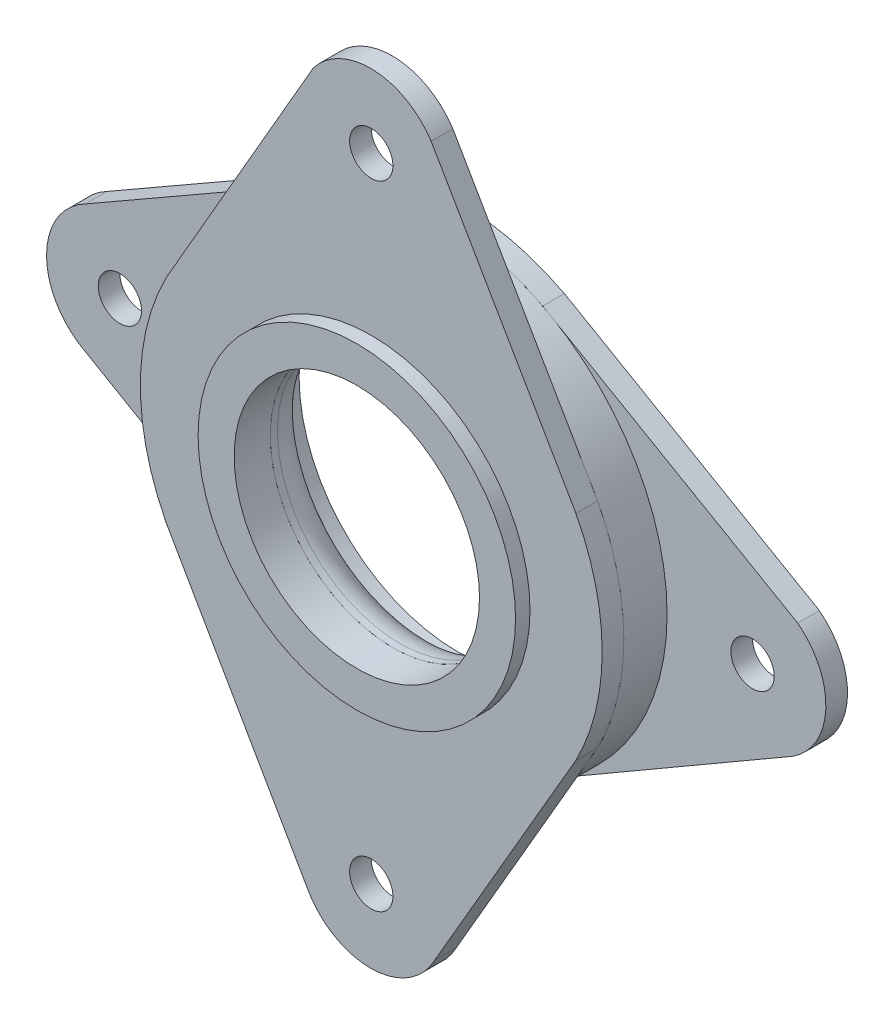
ISO-10303-21;
HEADER;
FILE_DESCRIPTION(('STEP AP214'),'2;1');
FILE_NAME('part.step','',(''),(''),'','','');
FILE_SCHEMA(('AUTOMOTIVE_DESIGN { 1 0 10303 214 1 1 1 1 }'));
ENDSEC;
DATA;
#1=APPLICATION_CONTEXT('core data for automotive mechanical design processes');
#2=APPLICATION_PROTOCOL_DEFINITION('international standard','automotive_design',2000,#1);
#3=PRODUCT_CONTEXT('',#1,'mechanical');
#4=PRODUCT('Part','Part','',(#3));
#5=PRODUCT_RELATED_PRODUCT_CATEGORY('part','',(#4));
#6=PRODUCT_DEFINITION_FORMATION('','',#4);
#7=PRODUCT_DEFINITION_CONTEXT('part definition',#1,'design');
#8=PRODUCT_DEFINITION('design','',#6,#7);
#9=PRODUCT_DEFINITION_SHAPE('','',#8);
#10=(LENGTH_UNIT() NAMED_UNIT(*) SI_UNIT(.MILLI.,.METRE.));
#11=(NAMED_UNIT(*) PLANE_ANGLE_UNIT() SI_UNIT($,.RADIAN.));
#12=(NAMED_UNIT(*) SI_UNIT($,.STERADIAN.) SOLID_ANGLE_UNIT());
#13=UNCERTAINTY_MEASURE_WITH_UNIT(LENGTH_MEASURE(1.E-05),#10,'distance_accuracy_value','');
#14=(GEOMETRIC_REPRESENTATION_CONTEXT(3) GLOBAL_UNCERTAINTY_ASSIGNED_CONTEXT((#13)) GLOBAL_UNIT_ASSIGNED_CONTEXT((#10,
#11,#12)) REPRESENTATION_CONTEXT('',''));
#15=CARTESIAN_POINT('',(0.,0.,0.));
#16=DIRECTION('',(0.,0.,1.));
#17=DIRECTION('',(1.,0.,0.));
#18=AXIS2_PLACEMENT_3D('',#15,#16,#17);
#19=CARTESIAN_POINT('',(0.,0.,1.5));
#20=DIRECTION('',(0.,0.,1.));
#21=DIRECTION('',(1.,0.,0.));
#22=AXIS2_PLACEMENT_3D('',#19,#20,#21);
#23=CYLINDRICAL_SURFACE('',#22,16.);
#24=CARTESIAN_POINT('',(0.,0.,1.5));
#25=DIRECTION('',(0.,0.,1.));
#26=DIRECTION('',(1.,0.,0.));
#27=AXIS2_PLACEMENT_3D('',#24,#25,#26);
#28=CIRCLE('',#27,16.);
#29=CARTESIAN_POINT('',(16.,0.,1.5));
#30=VERTEX_POINT('',#29);
#31=EDGE_CURVE('E61',#30,#30,#28,.T.);
#32=ORIENTED_EDGE('',*,*,#31,.T.);
#33=EDGE_LOOP('',(#32));
#34=FACE_BOUND('',#33,.T.);
#35=CARTESIAN_POINT('',(0.,0.,4.5));
#36=DIRECTION('',(0.,0.,1.));
#37=DIRECTION('',(1.,0.,0.));
#38=AXIS2_PLACEMENT_3D('',#35,#36,#37);
#39=CIRCLE('',#38,16.);
#40=CARTESIAN_POINT('',(16.,0.,4.5));
#41=VERTEX_POINT('',#40);
#42=EDGE_CURVE('E65',#41,#41,#39,.T.);
#43=ORIENTED_EDGE('',*,*,#42,.F.);
#44=EDGE_LOOP('',(#43));
#45=FACE_BOUND('',#44,.T.);
#46=ADVANCED_FACE('F50',(#34,#45),#23,.T.);
#47=CARTESIAN_POINT('',(0.,0.,1.5));
#48=DIRECTION('',(0.,0.,1.));
#49=DIRECTION('',(1.,0.,0.));
#50=AXIS2_PLACEMENT_3D('',#47,#48,#49);
#51=PLANE('',#50);
#52=CARTESIAN_POINT('',(0.,0.,1.5));
#53=DIRECTION('',(0.,0.,1.));
#54=DIRECTION('',(1.,0.,0.));
#55=AXIS2_PLACEMENT_3D('',#52,#53,#54);
#56=CIRCLE('',#55,11.);
#57=CARTESIAN_POINT('',(11.,0.,1.5));
#58=VERTEX_POINT('',#57);
#59=EDGE_CURVE('E57',#58,#58,#56,.T.);
#60=ORIENTED_EDGE('',*,*,#59,.T.);
#61=EDGE_LOOP('',(#60));
#62=FACE_BOUND('',#61,.T.);
#63=ORIENTED_EDGE('',*,*,#31,.F.);
#64=EDGE_LOOP('',(#63));
#65=FACE_BOUND('',#64,.T.);
#66=ADVANCED_FACE('F85',(#62,#65),#51,.F.);
#67=CARTESIAN_POINT('',(0.,0.,1.5));
#68=DIRECTION('',(0.,0.,1.));
#69=DIRECTION('',(1.,0.,0.));
#70=AXIS2_PLACEMENT_3D('',#67,#68,#69);
#71=CYLINDRICAL_SURFACE('',#70,8.5);
#72=CARTESIAN_POINT('',(0.,0.,4.));
#73=DIRECTION('',(0.,0.,1.));
#74=DIRECTION('',(1.,0.,0.));
#75=AXIS2_PLACEMENT_3D('',#72,#73,#74);
#76=CIRCLE('',#75,8.5);
#77=CARTESIAN_POINT('',(8.5,0.,4.));
#78=VERTEX_POINT('',#77);
#79=EDGE_CURVE('E11',#78,#78,#76,.F.);
#80=ORIENTED_EDGE('',*,*,#79,.T.);
#81=EDGE_LOOP('',(#80));
#82=FACE_BOUND('',#81,.T.);
#83=CARTESIAN_POINT('',(0.,0.,4.5));
#84=DIRECTION('',(0.,0.,1.));
#85=DIRECTION('',(1.,0.,0.));
#86=AXIS2_PLACEMENT_3D('',#83,#84,#85);
#87=CIRCLE('',#86,8.5);
#88=CARTESIAN_POINT('',(8.5,0.,4.5));
#89=VERTEX_POINT('',#88);
#90=EDGE_CURVE('E70',#89,#89,#87,.T.);
#91=ORIENTED_EDGE('',*,*,#90,.T.);
#92=EDGE_LOOP('',(#91));
#93=FACE_BOUND('',#92,.T.);
#94=ADVANCED_FACE('F74',(#82,#93),#71,.F.);
#95=CARTESIAN_POINT('',(0.,0.,4.5));
#96=DIRECTION('',(0.,0.,1.));
#97=DIRECTION('',(1.,0.,0.));
#98=AXIS2_PLACEMENT_3D('',#95,#96,#97);
#99=PLANE('',#98);
#100=ORIENTED_EDGE('',*,*,#42,.T.);
#101=EDGE_LOOP('',(#100));
#102=FACE_BOUND('',#101,.T.);
#103=ORIENTED_EDGE('',*,*,#90,.F.);
#104=EDGE_LOOP('',(#103));
#105=FACE_BOUND('',#104,.T.);
#106=ADVANCED_FACE('F76',(#102,#105),#99,.T.);
#107=CARTESIAN_POINT('',(0.,0.,4.));
#108=DIRECTION('',(0.,0.,1.));
#109=DIRECTION('',(1.,0.,0.));
#110=AXIS2_PLACEMENT_3D('',#107,#108,#109);
#111=TOROIDAL_SURFACE('',#110,11.,2.5);
#112=ORIENTED_EDGE('',*,*,#79,.F.);
#113=EDGE_LOOP('',(#112));
#114=FACE_BOUND('',#113,.T.);
#115=ORIENTED_EDGE('',*,*,#59,.F.);
#116=EDGE_LOOP('',(#115));
#117=FACE_BOUND('',#116,.T.);
#118=ADVANCED_FACE('F52',(#114,#117),#111,.T.);
#119=CLOSED_SHELL('',(#46,#66,#94,#106,#118));
#120=MANIFOLD_SOLID_BREP('B2',#119);
#121=CARTESIAN_POINT('',(0.,0.,6.));
#122=DIRECTION('',(0.,0.,-1.));
#123=DIRECTION('',(0.,1.,0.));
#124=AXIS2_PLACEMENT_3D('',#121,#122,#123);
#125=PLANE('',#124);
#126=CARTESIAN_POINT('',(0.,0.,6.));
#127=DIRECTION('',(0.,0.,1.));
#128=DIRECTION('',(0.,1.,0.));
#129=AXIS2_PLACEMENT_3D('',#126,#127,#128);
#130=CIRCLE('',#129,16.);
#131=CARTESIAN_POINT('',(-14.1966447321718,7.37938197605322,6.));
#132=VERTEX_POINT('',#131);
#133=CARTESIAN_POINT('',(-14.2247700532383,-7.32501992710561,6.));
#134=VERTEX_POINT('',#133);
#135=EDGE_CURVE('E236',#132,#134,#130,.T.);
#136=ORIENTED_EDGE('',*,*,#135,.T.);
#137=DIRECTION('',(0.497671621854892,-0.867365526638176,0.));
#138=VECTOR('',#137,1.);
#139=CARTESIAN_POINT('',(-4.479321595876,-24.3098461907375,6.));
#140=LINE('',#139,#138);
#141=CARTESIAN_POINT('',(-4.479321595876,-24.3098461907375,6.));
#142=VERTEX_POINT('',#141);
#143=EDGE_CURVE('E238',#134,#142,#140,.T.);
#144=ORIENTED_EDGE('',*,*,#143,.T.);
#145=CARTESIAN_POINT('',(-0.0448656845738966,-21.9999542515512,6.));
#146=DIRECTION('',(0.,0.,1.));
#147=DIRECTION('',(0.,1.,0.));
#148=AXIS2_PLACEMENT_3D('',#145,#146,#147);
#149=CIRCLE('',#148,5.);
#150=CARTESIAN_POINT('',(4.39320110895157,-24.3029008719067,6.));
#151=VERTEX_POINT('',#150);
#152=EDGE_CURVE('E242',#142,#151,#149,.T.);
#153=ORIENTED_EDGE('',*,*,#152,.T.);
#154=DIRECTION('',(0.501355621248353,0.86524131954194,0.));
#155=VECTOR('',#154,1.);
#156=CARTESIAN_POINT('',(4.39320110895158,-24.3029008719067,6.));
#157=LINE('',#156,#155);
#158=CARTESIAN_POINT('',(14.1719290272993,-7.4267373486069,6.));
#159=VERTEX_POINT('',#158);
#160=EDGE_CURVE('E245',#151,#159,#157,.T.);
#161=ORIENTED_EDGE('',*,*,#160,.T.);
#162=CARTESIAN_POINT('',(0.,0.,6.));
#163=DIRECTION('',(0.,0.,1.));
#164=DIRECTION('',(0.,1.,0.));
#165=AXIS2_PLACEMENT_3D('',#162,#163,#164);
#166=CIRCLE('',#165,16.);
#167=CARTESIAN_POINT('',(14.1817399706489,7.40798565096466,6.));
#168=VERTEX_POINT('',#167);
#169=EDGE_CURVE('E248',#159,#168,#166,.T.);
#170=ORIENTED_EDGE('',*,*,#169,.T.);
#171=DIRECTION('',(-0.501345194138575,0.865247361344809,0.));
#172=VECTOR('',#171,1.);
#173=CARTESIAN_POINT('',(14.1817399706489,7.40798565096467,6.));
#174=LINE('',#173,#172);
#175=CARTESIAN_POINT('',(4.15252442844814,24.7169224587822,6.));
#176=VERTEX_POINT('',#175);
#177=EDGE_CURVE('E251',#168,#176,#174,.T.);
#178=ORIENTED_EDGE('',*,*,#177,.T.);
#179=CARTESIAN_POINT('',(-0.0448656845740502,21.9999542515512,6.));
#180=DIRECTION('',(0.,0.,1.));
#181=DIRECTION('',(0.,1.,0.));
#182=AXIS2_PLACEMENT_3D('',#179,#180,#181);
#183=CIRCLE('',#182,5.);
#184=CARTESIAN_POINT('',(-4.00944343188171,25.0466119752795,6.));
#185=VERTEX_POINT('',#184);
#186=EDGE_CURVE('E219',#176,#185,#183,.T.);
#187=ORIENTED_EDGE('',*,*,#186,.T.);
#188=DIRECTION('',(-0.499522622797943,-0.866300842267318,0.));
#189=VECTOR('',#188,1.);
#190=CARTESIAN_POINT('',(-14.1966447321718,7.37938197605322,6.));
#191=LINE('',#190,#189);
#192=EDGE_CURVE('E182',#185,#132,#191,.T.);
#193=ORIENTED_EDGE('',*,*,#192,.T.);
#194=EDGE_LOOP('',(#136,#144,#153,#161,#170,#178,#187,#193));
#195=FACE_BOUND('',#194,.T.);
#196=CARTESIAN_POINT('',(0.,21.92,6.));
#197=DIRECTION('',(0.,0.,1.));
#198=DIRECTION('',(0.,1.,0.));
#199=AXIS2_PLACEMENT_3D('',#196,#197,#198);
#200=CIRCLE('',#199,1.5);
#201=CARTESIAN_POINT('',(0.,23.42,6.));
#202=VERTEX_POINT('',#201);
#203=EDGE_CURVE('E298',#202,#202,#200,.T.);
#204=ORIENTED_EDGE('',*,*,#203,.F.);
#205=EDGE_LOOP('',(#204));
#206=FACE_BOUND('',#205,.T.);
#207=CARTESIAN_POINT('',(0.,-21.92,6.));
#208=DIRECTION('',(0.,0.,1.));
#209=DIRECTION('',(0.,1.,0.));
#210=AXIS2_PLACEMENT_3D('',#207,#208,#209);
#211=CIRCLE('',#210,1.5);
#212=CARTESIAN_POINT('',(0.,-20.42,6.));
#213=VERTEX_POINT('',#212);
#214=EDGE_CURVE('E239',#213,#213,#211,.T.);
#215=ORIENTED_EDGE('',*,*,#214,.F.);
#216=EDGE_LOOP('',(#215));
#217=FACE_BOUND('',#216,.T.);
#218=CARTESIAN_POINT('',(0.,0.,6.));
#219=DIRECTION('',(0.,0.,-1.));
#220=DIRECTION('',(-1.,0.,0.));
#221=AXIS2_PLACEMENT_3D('',#218,#219,#220);
#222=CIRCLE('',#221,11.);
#223=CARTESIAN_POINT('',(-11.,0.,6.));
#224=VERTEX_POINT('',#223);
#225=EDGE_CURVE('E48',#224,#224,#222,.F.);
#226=ORIENTED_EDGE('',*,*,#225,.F.);
#227=EDGE_LOOP('',(#226));
#228=FACE_BOUND('',#227,.T.);
#229=ADVANCED_FACE('F139',(#195,#206,#217,#228),#125,.F.);
#230=CARTESIAN_POINT('',(0.,0.,4.5));
#231=DIRECTION('',(0.,0.,1.));
#232=DIRECTION('',(0.,-1.,0.));
#233=AXIS2_PLACEMENT_3D('',#230,#231,#232);
#234=CYLINDRICAL_SURFACE('',#233,16.);
#235=ORIENTED_EDGE('',*,*,#135,.F.);
#236=DIRECTION('',(0.,0.,1.));
#237=VECTOR('',#236,1.);
#238=CARTESIAN_POINT('',(-14.1966447321718,7.37938197605322,4.5));
#239=LINE('',#238,#237);
#240=CARTESIAN_POINT('',(-14.1966447321718,7.37938197605322,4.5));
#241=VERTEX_POINT('',#240);
#242=EDGE_CURVE('E235',#241,#132,#239,.T.);
#243=ORIENTED_EDGE('',*,*,#242,.F.);
#244=CARTESIAN_POINT('',(0.,0.,4.5));
#245=DIRECTION('',(0.,0.,1.));
#246=DIRECTION('',(0.,1.,0.));
#247=AXIS2_PLACEMENT_3D('',#244,#245,#246);
#248=CIRCLE('',#247,16.);
#249=CARTESIAN_POINT('',(-14.2247700532383,-7.32501992710561,4.5));
#250=VERTEX_POINT('',#249);
#251=EDGE_CURVE('E255',#241,#250,#248,.T.);
#252=ORIENTED_EDGE('',*,*,#251,.T.);
#253=DIRECTION('',(0.,0.,1.));
#254=VECTOR('',#253,1.);
#255=CARTESIAN_POINT('',(-14.2247700532383,-7.32501992710561,4.5));
#256=LINE('',#255,#254);
#257=EDGE_CURVE('E148',#250,#134,#256,.T.);
#258=ORIENTED_EDGE('',*,*,#257,.T.);
#259=EDGE_LOOP('',(#235,#243,#252,#258));
#260=FACE_BOUND('',#259,.T.);
#261=ADVANCED_FACE('F141',(#260),#234,.T.);
#262=CARTESIAN_POINT('',(-4.479321595876,-24.3098461907375,4.5));
#263=DIRECTION('',(0.867365526638176,0.497671621854892,0.));
#264=DIRECTION('',(-0.497671621854892,0.867365526638176,0.));
#265=AXIS2_PLACEMENT_3D('',#262,#263,#264);
#266=PLANE('',#265);
#267=ORIENTED_EDGE('',*,*,#143,.F.);
#268=ORIENTED_EDGE('',*,*,#257,.F.);
#269=DIRECTION('',(0.497671621854892,-0.867365526638176,0.));
#270=VECTOR('',#269,1.);
#271=CARTESIAN_POINT('',(-4.479321595876,-24.3098461907375,4.5));
#272=LINE('',#271,#270);
#273=CARTESIAN_POINT('',(-4.479321595876,-24.3098461907375,4.5));
#274=VERTEX_POINT('',#273);
#275=EDGE_CURVE('E194',#250,#274,#272,.T.);
#276=ORIENTED_EDGE('',*,*,#275,.T.);
#277=DIRECTION('',(0.,0.,1.));
#278=VECTOR('',#277,1.);
#279=CARTESIAN_POINT('',(-4.479321595876,-24.3098461907375,4.5));
#280=LINE('',#279,#278);
#281=EDGE_CURVE('E265',#274,#142,#280,.T.);
#282=ORIENTED_EDGE('',*,*,#281,.T.);
#283=EDGE_LOOP('',(#267,#268,#276,#282));
#284=FACE_BOUND('',#283,.T.);
#285=ADVANCED_FACE('F274',(#284),#266,.F.);
#286=CARTESIAN_POINT('',(-0.0448656845738966,-21.9999542515512,4.5));
#287=DIRECTION('',(0.,0.,1.));
#288=DIRECTION('',(0.,-1.,0.));
#289=AXIS2_PLACEMENT_3D('',#286,#287,#288);
#290=CYLINDRICAL_SURFACE('',#289,5.);
#291=ORIENTED_EDGE('',*,*,#152,.F.);
#292=ORIENTED_EDGE('',*,*,#281,.F.);
#293=CARTESIAN_POINT('',(-0.0448656845738966,-21.9999542515512,4.5));
#294=DIRECTION('',(0.,0.,1.));
#295=DIRECTION('',(0.,1.,0.));
#296=AXIS2_PLACEMENT_3D('',#293,#294,#295);
#297=CIRCLE('',#296,5.);
#298=CARTESIAN_POINT('',(4.39320110895157,-24.3029008719067,4.5));
#299=VERTEX_POINT('',#298);
#300=EDGE_CURVE('E279',#274,#299,#297,.T.);
#301=ORIENTED_EDGE('',*,*,#300,.T.);
#302=DIRECTION('',(0.,0.,1.));
#303=VECTOR('',#302,1.);
#304=CARTESIAN_POINT('',(4.39320110895157,-24.3029008719067,4.5));
#305=LINE('',#304,#303);
#306=EDGE_CURVE('E262',#299,#151,#305,.T.);
#307=ORIENTED_EDGE('',*,*,#306,.T.);
#308=EDGE_LOOP('',(#291,#292,#301,#307));
#309=FACE_BOUND('',#308,.T.);
#310=ADVANCED_FACE('F278',(#309),#290,.T.);
#311=CARTESIAN_POINT('',(4.39320110895158,-24.3029008719067,4.5));
#312=DIRECTION('',(-0.86524131954194,0.501355621248353,0.));
#313=DIRECTION('',(-0.501355621248353,-0.86524131954194,0.));
#314=AXIS2_PLACEMENT_3D('',#311,#312,#313);
#315=PLANE('',#314);
#316=ORIENTED_EDGE('',*,*,#160,.F.);
#317=ORIENTED_EDGE('',*,*,#306,.F.);
#318=DIRECTION('',(0.501355621248353,0.86524131954194,0.));
#319=VECTOR('',#318,1.);
#320=CARTESIAN_POINT('',(4.39320110895158,-24.3029008719067,4.5));
#321=LINE('',#320,#319);
#322=CARTESIAN_POINT('',(14.1719290272993,-7.4267373486069,4.5));
#323=VERTEX_POINT('',#322);
#324=EDGE_CURVE('E230',#299,#323,#321,.T.);
#325=ORIENTED_EDGE('',*,*,#324,.T.);
#326=DIRECTION('',(0.,0.,1.));
#327=VECTOR('',#326,1.);
#328=CARTESIAN_POINT('',(14.1719290272993,-7.4267373486069,4.5));
#329=LINE('',#328,#327);
#330=EDGE_CURVE('E259',#323,#159,#329,.T.);
#331=ORIENTED_EDGE('',*,*,#330,.T.);
#332=EDGE_LOOP('',(#316,#317,#325,#331));
#333=FACE_BOUND('',#332,.T.);
#334=ADVANCED_FACE('F283',(#333),#315,.F.);
#335=CARTESIAN_POINT('',(0.,0.,4.5));
#336=DIRECTION('',(0.,0.,1.));
#337=DIRECTION('',(0.,-1.,0.));
#338=AXIS2_PLACEMENT_3D('',#335,#336,#337);
#339=CYLINDRICAL_SURFACE('',#338,16.);
#340=ORIENTED_EDGE('',*,*,#169,.F.);
#341=ORIENTED_EDGE('',*,*,#330,.F.);
#342=CARTESIAN_POINT('',(0.,0.,4.5));
#343=DIRECTION('',(0.,0.,1.));
#344=DIRECTION('',(0.,1.,0.));
#345=AXIS2_PLACEMENT_3D('',#342,#343,#344);
#346=CIRCLE('',#345,16.);
#347=CARTESIAN_POINT('',(14.1817399706489,7.40798565096466,4.5));
#348=VERTEX_POINT('',#347);
#349=EDGE_CURVE('E228',#323,#348,#346,.T.);
#350=ORIENTED_EDGE('',*,*,#349,.T.);
#351=DIRECTION('',(0.,0.,1.));
#352=VECTOR('',#351,1.);
#353=CARTESIAN_POINT('',(14.1817399706489,7.40798565096466,4.5));
#354=LINE('',#353,#352);
#355=EDGE_CURVE('E222',#348,#168,#354,.T.);
#356=ORIENTED_EDGE('',*,*,#355,.T.);
#357=EDGE_LOOP('',(#340,#341,#350,#356));
#358=FACE_BOUND('',#357,.T.);
#359=ADVANCED_FACE('F286',(#358),#339,.T.);
#360=CARTESIAN_POINT('',(14.1817399706489,7.40798565096467,4.5));
#361=DIRECTION('',(-0.865247361344809,-0.501345194138575,0.));
#362=DIRECTION('',(0.501345194138575,-0.865247361344809,0.));
#363=AXIS2_PLACEMENT_3D('',#360,#361,#362);
#364=PLANE('',#363);
#365=ORIENTED_EDGE('',*,*,#177,.F.);
#366=ORIENTED_EDGE('',*,*,#355,.F.);
#367=DIRECTION('',(-0.501345194138575,0.865247361344809,0.));
#368=VECTOR('',#367,1.);
#369=CARTESIAN_POINT('',(14.1817399706489,7.40798565096467,4.5));
#370=LINE('',#369,#368);
#371=CARTESIAN_POINT('',(4.15252442844814,24.7169224587822,4.5));
#372=VERTEX_POINT('',#371);
#373=EDGE_CURVE('E212',#348,#372,#370,.T.);
#374=ORIENTED_EDGE('',*,*,#373,.T.);
#375=DIRECTION('',(0.,0.,1.));
#376=VECTOR('',#375,1.);
#377=CARTESIAN_POINT('',(4.15252442844814,24.7169224587822,4.5));
#378=LINE('',#377,#376);
#379=EDGE_CURVE('E217',#372,#176,#378,.T.);
#380=ORIENTED_EDGE('',*,*,#379,.T.);
#381=EDGE_LOOP('',(#365,#366,#374,#380));
#382=FACE_BOUND('',#381,.T.);
#383=ADVANCED_FACE('F225',(#382),#364,.F.);
#384=CARTESIAN_POINT('',(-0.0448656845740502,21.9999542515512,4.5));
#385=DIRECTION('',(0.,0.,1.));
#386=DIRECTION('',(0.,-1.,0.));
#387=AXIS2_PLACEMENT_3D('',#384,#385,#386);
#388=CYLINDRICAL_SURFACE('',#387,5.);
#389=ORIENTED_EDGE('',*,*,#186,.F.);
#390=ORIENTED_EDGE('',*,*,#379,.F.);
#391=CARTESIAN_POINT('',(-0.0448656845740502,21.9999542515512,4.5));
#392=DIRECTION('',(0.,0.,1.));
#393=DIRECTION('',(0.,1.,0.));
#394=AXIS2_PLACEMENT_3D('',#391,#392,#393);
#395=CIRCLE('',#394,5.);
#396=CARTESIAN_POINT('',(-4.00944343188171,25.0466119752795,4.5));
#397=VERTEX_POINT('',#396);
#398=EDGE_CURVE('E208',#372,#397,#395,.T.);
#399=ORIENTED_EDGE('',*,*,#398,.T.);
#400=DIRECTION('',(0.,0.,1.));
#401=VECTOR('',#400,1.);
#402=CARTESIAN_POINT('',(-4.00944343188171,25.0466119752795,4.5));
#403=LINE('',#402,#401);
#404=EDGE_CURVE('E223',#397,#185,#403,.T.);
#405=ORIENTED_EDGE('',*,*,#404,.T.);
#406=EDGE_LOOP('',(#389,#390,#399,#405));
#407=FACE_BOUND('',#406,.T.);
#408=ADVANCED_FACE('F218',(#407),#388,.T.);
#409=CARTESIAN_POINT('',(-14.1966447321718,7.37938197605322,4.5));
#410=DIRECTION('',(0.866300842267318,-0.499522622797943,0.));
#411=DIRECTION('',(0.499522622797943,0.866300842267318,0.));
#412=AXIS2_PLACEMENT_3D('',#409,#410,#411);
#413=PLANE('',#412);
#414=ORIENTED_EDGE('',*,*,#192,.F.);
#415=ORIENTED_EDGE('',*,*,#404,.F.);
#416=DIRECTION('',(-0.499522622797943,-0.866300842267318,0.));
#417=VECTOR('',#416,1.);
#418=CARTESIAN_POINT('',(-14.1966447321718,7.37938197605322,4.5));
#419=LINE('',#418,#417);
#420=EDGE_CURVE('E156',#397,#241,#419,.T.);
#421=ORIENTED_EDGE('',*,*,#420,.T.);
#422=ORIENTED_EDGE('',*,*,#242,.T.);
#423=EDGE_LOOP('',(#414,#415,#421,#422));
#424=FACE_BOUND('',#423,.T.);
#425=ADVANCED_FACE('F337',(#424),#413,.F.);
#426=CARTESIAN_POINT('',(0.,0.,4.5));
#427=DIRECTION('',(0.,0.,-1.));
#428=DIRECTION('',(0.,1.,0.));
#429=AXIS2_PLACEMENT_3D('',#426,#427,#428);
#430=PLANE('',#429);
#431=CARTESIAN_POINT('',(0.,-21.92,4.5));
#432=DIRECTION('',(0.,0.,1.));
#433=DIRECTION('',(0.,1.,0.));
#434=AXIS2_PLACEMENT_3D('',#431,#432,#433);
#435=CIRCLE('',#434,1.5);
#436=CARTESIAN_POINT('',(0.,-20.42,4.5));
#437=VERTEX_POINT('',#436);
#438=EDGE_CURVE('E301',#437,#437,#435,.T.);
#439=ORIENTED_EDGE('',*,*,#438,.T.);
#440=EDGE_LOOP('',(#439));
#441=FACE_BOUND('',#440,.T.);
#442=CARTESIAN_POINT('',(0.,21.92,4.5));
#443=DIRECTION('',(0.,0.,1.));
#444=DIRECTION('',(0.,1.,0.));
#445=AXIS2_PLACEMENT_3D('',#442,#443,#444);
#446=CIRCLE('',#445,1.5);
#447=CARTESIAN_POINT('',(0.,23.42,4.5));
#448=VERTEX_POINT('',#447);
#449=EDGE_CURVE('E294',#448,#448,#446,.T.);
#450=ORIENTED_EDGE('',*,*,#449,.T.);
#451=EDGE_LOOP('',(#450));
#452=FACE_BOUND('',#451,.T.);
#453=CARTESIAN_POINT('',(0.,0.,4.5));
#454=DIRECTION('',(0.,0.,1.));
#455=DIRECTION('',(0.,1.,0.));
#456=AXIS2_PLACEMENT_3D('',#453,#454,#455);
#457=CIRCLE('',#456,8.5);
#458=CARTESIAN_POINT('',(0.,8.5,4.5));
#459=VERTEX_POINT('',#458);
#460=EDGE_CURVE('E291',#459,#459,#457,.T.);
#461=ORIENTED_EDGE('',*,*,#460,.T.);
#462=EDGE_LOOP('',(#461));
#463=FACE_BOUND('',#462,.T.);
#464=ORIENTED_EDGE('',*,*,#251,.F.);
#465=ORIENTED_EDGE('',*,*,#420,.F.);
#466=ORIENTED_EDGE('',*,*,#398,.F.);
#467=ORIENTED_EDGE('',*,*,#373,.F.);
#468=ORIENTED_EDGE('',*,*,#349,.F.);
#469=ORIENTED_EDGE('',*,*,#324,.F.);
#470=ORIENTED_EDGE('',*,*,#300,.F.);
#471=ORIENTED_EDGE('',*,*,#275,.F.);
#472=EDGE_LOOP('',(#464,#465,#466,#467,#468,#469,#470,#471));
#473=FACE_BOUND('',#472,.T.);
#474=ADVANCED_FACE('F210',(#441,#452,#463,#473),#430,.T.);
#475=CARTESIAN_POINT('',(0.,0.,6.));
#476=DIRECTION('',(0.,0.,-1.));
#477=DIRECTION('',(0.,1.,0.));
#478=AXIS2_PLACEMENT_3D('',#475,#476,#477);
#479=CYLINDRICAL_SURFACE('',#478,8.5);
#480=ORIENTED_EDGE('',*,*,#460,.F.);
#481=EDGE_LOOP('',(#480));
#482=FACE_BOUND('',#481,.T.);
#483=CARTESIAN_POINT('',(0.,0.,7.));
#484=DIRECTION('',(0.,0.,1.));
#485=DIRECTION('',(1.,0.,0.));
#486=AXIS2_PLACEMENT_3D('',#483,#484,#485);
#487=CIRCLE('',#486,8.5);
#488=CARTESIAN_POINT('',(8.5,0.,7.));
#489=VERTEX_POINT('',#488);
#490=EDGE_CURVE('E308',#489,#489,#487,.T.);
#491=ORIENTED_EDGE('',*,*,#490,.T.);
#492=EDGE_LOOP('',(#491));
#493=FACE_BOUND('',#492,.T.);
#494=ADVANCED_FACE('F312',(#482,#493),#479,.F.);
#495=CARTESIAN_POINT('',(0.,21.92,6.));
#496=DIRECTION('',(0.,0.,-1.));
#497=DIRECTION('',(0.,1.,0.));
#498=AXIS2_PLACEMENT_3D('',#495,#496,#497);
#499=CYLINDRICAL_SURFACE('',#498,1.5);
#500=ORIENTED_EDGE('',*,*,#203,.T.);
#501=EDGE_LOOP('',(#500));
#502=FACE_BOUND('',#501,.T.);
#503=ORIENTED_EDGE('',*,*,#449,.F.);
#504=EDGE_LOOP('',(#503));
#505=FACE_BOUND('',#504,.T.);
#506=ADVANCED_FACE('F326',(#502,#505),#499,.F.);
#507=CARTESIAN_POINT('',(0.,-21.92,6.));
#508=DIRECTION('',(0.,0.,-1.));
#509=DIRECTION('',(0.,1.,0.));
#510=AXIS2_PLACEMENT_3D('',#507,#508,#509);
#511=CYLINDRICAL_SURFACE('',#510,1.5);
#512=ORIENTED_EDGE('',*,*,#214,.T.);
#513=EDGE_LOOP('',(#512));
#514=FACE_BOUND('',#513,.T.);
#515=ORIENTED_EDGE('',*,*,#438,.F.);
#516=EDGE_LOOP('',(#515));
#517=FACE_BOUND('',#516,.T.);
#518=ADVANCED_FACE('F317',(#514,#517),#511,.F.);
#519=CARTESIAN_POINT('',(0.,0.,7.));
#520=DIRECTION('',(0.,0.,1.));
#521=DIRECTION('',(1.,0.,0.));
#522=AXIS2_PLACEMENT_3D('',#519,#520,#521);
#523=PLANE('',#522);
#524=CARTESIAN_POINT('',(0.,0.,7.));
#525=DIRECTION('',(0.,0.,1.));
#526=DIRECTION('',(1.,0.,0.));
#527=AXIS2_PLACEMENT_3D('',#524,#525,#526);
#528=CIRCLE('',#527,11.);
#529=CARTESIAN_POINT('',(11.,0.,7.));
#530=VERTEX_POINT('',#529);
#531=EDGE_CURVE('E295',#530,#530,#528,.T.);
#532=ORIENTED_EDGE('',*,*,#531,.T.);
#533=EDGE_LOOP('',(#532));
#534=FACE_BOUND('',#533,.T.);
#535=ORIENTED_EDGE('',*,*,#490,.F.);
#536=EDGE_LOOP('',(#535));
#537=FACE_BOUND('',#536,.T.);
#538=ADVANCED_FACE('F314',(#534,#537),#523,.T.);
#539=CARTESIAN_POINT('',(0.,0.,7.));
#540=DIRECTION('',(0.,0.,-1.));
#541=DIRECTION('',(-1.,0.,0.));
#542=AXIS2_PLACEMENT_3D('',#539,#540,#541);
#543=CYLINDRICAL_SURFACE('',#542,11.);
#544=ORIENTED_EDGE('',*,*,#531,.F.);
#545=EDGE_LOOP('',(#544));
#546=FACE_BOUND('',#545,.T.);
#547=ORIENTED_EDGE('',*,*,#225,.T.);
#548=EDGE_LOOP('',(#547));
#549=FACE_BOUND('',#548,.T.);
#550=ADVANCED_FACE('F316',(#546,#549),#543,.T.);
#551=CLOSED_SHELL('',(#229,#261,#285,#310,#334,#359,#383,#408,#425,#474,#494,#506,#518,#538,#550));
#552=MANIFOLD_SOLID_BREP('B6',#551);
#553=CARTESIAN_POINT('',(0.,0.,1.5));
#554=DIRECTION('',(0.,0.,-1.));
#555=DIRECTION('',(-1.,0.,0.));
#556=AXIS2_PLACEMENT_3D('',#553,#554,#555);
#557=CYLINDRICAL_SURFACE('',#556,16.);
#558=CARTESIAN_POINT('',(0.,0.,0.));
#559=DIRECTION('',(0.,0.,1.));
#560=DIRECTION('',(1.,0.,0.));
#561=AXIS2_PLACEMENT_3D('',#558,#559,#560);
#562=CIRCLE('',#561,16.);
#563=CARTESIAN_POINT('',(7.37938197605327,14.1966447321718,0.));
#564=VERTEX_POINT('',#563);
#565=CARTESIAN_POINT('',(-7.32501992710556,14.2247700532383,0.));
#566=VERTEX_POINT('',#565);
#567=EDGE_CURVE('E596',#564,#566,#562,.T.);
#568=ORIENTED_EDGE('',*,*,#567,.T.);
#569=DIRECTION('',(0.,0.,-1.));
#570=VECTOR('',#569,1.);
#571=CARTESIAN_POINT('',(-7.32501992710556,14.2247700532383,1.5));
#572=LINE('',#571,#570);
#573=CARTESIAN_POINT('',(-7.32501992710556,14.2247700532383,1.5));
#574=VERTEX_POINT('',#573);
#575=EDGE_CURVE('E137',#574,#566,#572,.T.);
#576=ORIENTED_EDGE('',*,*,#575,.F.);
#577=CARTESIAN_POINT('',(0.,0.,1.5));
#578=DIRECTION('',(0.,0.,1.));
#579=DIRECTION('',(1.,0.,0.));
#580=AXIS2_PLACEMENT_3D('',#577,#578,#579);
#581=CIRCLE('',#580,16.);
#582=CARTESIAN_POINT('',(7.37938197605327,14.1966447321718,1.5));
#583=VERTEX_POINT('',#582);
#584=EDGE_CURVE('E611',#583,#574,#581,.T.);
#585=ORIENTED_EDGE('',*,*,#584,.F.);
#586=DIRECTION('',(0.,0.,-1.));
#587=VECTOR('',#586,1.);
#588=CARTESIAN_POINT('',(7.37938197605327,14.1966447321718,1.5));
#589=LINE('',#588,#587);
#590=EDGE_CURVE('E592',#583,#564,#589,.T.);
#591=ORIENTED_EDGE('',*,*,#590,.T.);
#592=EDGE_LOOP('',(#568,#576,#585,#591));
#593=FACE_BOUND('',#592,.T.);
#594=ADVANCED_FACE('F500',(#593),#557,.T.);
#595=CARTESIAN_POINT('',(-24.3098461907375,4.47932159587608,1.5));
#596=DIRECTION('',(0.497671621854889,-0.867365526638178,0.));
#597=DIRECTION('',(0.867365526638178,0.497671621854889,0.));
#598=AXIS2_PLACEMENT_3D('',#595,#596,#597);
#599=PLANE('',#598);
#600=DIRECTION('',(-0.867365526638178,-0.497671621854889,0.));
#601=VECTOR('',#600,1.);
#602=CARTESIAN_POINT('',(-24.3098461907375,4.47932159587608,0.));
#603=LINE('',#602,#601);
#604=CARTESIAN_POINT('',(-24.3098461907375,4.47932159587608,0.));
#605=VERTEX_POINT('',#604);
#606=EDGE_CURVE('E599',#566,#605,#603,.T.);
#607=ORIENTED_EDGE('',*,*,#606,.T.);
#608=DIRECTION('',(0.,0.,-1.));
#609=VECTOR('',#608,1.);
#610=CARTESIAN_POINT('',(-24.3098461907375,4.47932159587608,1.5));
#611=LINE('',#610,#609);
#612=CARTESIAN_POINT('',(-24.3098461907375,4.47932159587608,1.5));
#613=VERTEX_POINT('',#612);
#614=EDGE_CURVE('E508',#613,#605,#611,.T.);
#615=ORIENTED_EDGE('',*,*,#614,.F.);
#616=DIRECTION('',(-0.867365526638178,-0.497671621854889,0.));
#617=VECTOR('',#616,1.);
#618=CARTESIAN_POINT('',(-24.3098461907375,4.47932159587608,1.5));
#619=LINE('',#618,#617);
#620=EDGE_CURVE('E559',#574,#613,#619,.T.);
#621=ORIENTED_EDGE('',*,*,#620,.F.);
#622=ORIENTED_EDGE('',*,*,#575,.T.);
#623=EDGE_LOOP('',(#607,#615,#621,#622));
#624=FACE_BOUND('',#623,.T.);
#625=ADVANCED_FACE('F689',(#624),#599,.F.);
#626=CARTESIAN_POINT('',(-21.9999542515512,0.0448656845739734,1.5));
#627=DIRECTION('',(0.,0.,-1.));
#628=DIRECTION('',(-1.,0.,0.));
#629=AXIS2_PLACEMENT_3D('',#626,#627,#628);
#630=CYLINDRICAL_SURFACE('',#629,5.);
#631=CARTESIAN_POINT('',(-21.9999542515512,0.0448656845739734,0.));
#632=DIRECTION('',(0.,0.,1.));
#633=DIRECTION('',(1.,0.,0.));
#634=AXIS2_PLACEMENT_3D('',#631,#632,#633);
#635=CIRCLE('',#634,5.);
#636=CARTESIAN_POINT('',(-24.3029008719067,-4.39320110895149,0.));
#637=VERTEX_POINT('',#636);
#638=EDGE_CURVE('E602',#605,#637,#635,.T.);
#639=ORIENTED_EDGE('',*,*,#638,.T.);
#640=DIRECTION('',(0.,0.,-1.));
#641=VECTOR('',#640,1.);
#642=CARTESIAN_POINT('',(-24.3029008719067,-4.39320110895149,1.5));
#643=LINE('',#642,#641);
#644=CARTESIAN_POINT('',(-24.3029008719067,-4.39320110895149,1.5));
#645=VERTEX_POINT('',#644);
#646=EDGE_CURVE('E618',#645,#637,#643,.T.);
#647=ORIENTED_EDGE('',*,*,#646,.F.);
#648=CARTESIAN_POINT('',(-21.9999542515512,0.0448656845739734,1.5));
#649=DIRECTION('',(0.,0.,1.));
#650=DIRECTION('',(1.,0.,0.));
#651=AXIS2_PLACEMENT_3D('',#648,#649,#650);
#652=CIRCLE('',#651,5.);
#653=EDGE_CURVE('E626',#613,#645,#652,.T.);
#654=ORIENTED_EDGE('',*,*,#653,.F.);
#655=ORIENTED_EDGE('',*,*,#614,.T.);
#656=EDGE_LOOP('',(#639,#647,#654,#655));
#657=FACE_BOUND('',#656,.T.);
#658=ADVANCED_FACE('F624',(#657),#630,.T.);
#659=CARTESIAN_POINT('',(-24.3029008719067,-4.39320110895149,1.5));
#660=DIRECTION('',(0.501355621248356,0.865241319541938,0.));
#661=DIRECTION('',(-0.865241319541939,0.501355621248356,0.));
#662=AXIS2_PLACEMENT_3D('',#659,#660,#661);
#663=PLANE('',#662);
#664=DIRECTION('',(0.865241319541939,-0.501355621248356,0.));
#665=VECTOR('',#664,1.);
#666=CARTESIAN_POINT('',(-24.3029008719067,-4.39320110895149,0.));
#667=LINE('',#666,#665);
#668=CARTESIAN_POINT('',(-7.42673734860694,-14.1719290272992,0.));
#669=VERTEX_POINT('',#668);
#670=EDGE_CURVE('E604',#637,#669,#667,.T.);
#671=ORIENTED_EDGE('',*,*,#670,.T.);
#672=DIRECTION('',(0.,0.,-1.));
#673=VECTOR('',#672,1.);
#674=CARTESIAN_POINT('',(-7.42673734860694,-14.1719290272992,1.5));
#675=LINE('',#674,#673);
#676=CARTESIAN_POINT('',(-7.42673734860694,-14.1719290272992,1.5));
#677=VERTEX_POINT('',#676);
#678=EDGE_CURVE('E615',#677,#669,#675,.T.);
#679=ORIENTED_EDGE('',*,*,#678,.F.);
#680=DIRECTION('',(0.865241319541939,-0.501355621248356,0.));
#681=VECTOR('',#680,1.);
#682=CARTESIAN_POINT('',(-24.3029008719067,-4.39320110895149,1.5));
#683=LINE('',#682,#681);
#684=EDGE_CURVE('E638',#645,#677,#683,.T.);
#685=ORIENTED_EDGE('',*,*,#684,.F.);
#686=ORIENTED_EDGE('',*,*,#646,.T.);
#687=EDGE_LOOP('',(#671,#679,#685,#686));
#688=FACE_BOUND('',#687,.T.);
#689=ADVANCED_FACE('F634',(#688),#663,.F.);
#690=CARTESIAN_POINT('',(0.,0.,1.5));
#691=DIRECTION('',(0.,0.,-1.));
#692=DIRECTION('',(-1.,0.,0.));
#693=AXIS2_PLACEMENT_3D('',#690,#691,#692);
#694=CYLINDRICAL_SURFACE('',#693,16.);
#695=CARTESIAN_POINT('',(0.,0.,0.));
#696=DIRECTION('',(0.,0.,1.));
#697=DIRECTION('',(1.,0.,0.));
#698=AXIS2_PLACEMENT_3D('',#695,#696,#697);
#699=CIRCLE('',#698,16.);
#700=CARTESIAN_POINT('',(7.40798565096461,-14.181739970649,0.));
#701=VERTEX_POINT('',#700);
#702=EDGE_CURVE('E606',#669,#701,#699,.T.);
#703=ORIENTED_EDGE('',*,*,#702,.T.);
#704=DIRECTION('',(0.,0.,-1.));
#705=VECTOR('',#704,1.);
#706=CARTESIAN_POINT('',(7.40798565096461,-14.181739970649,1.5));
#707=LINE('',#706,#705);
#708=CARTESIAN_POINT('',(7.40798565096461,-14.181739970649,1.5));
#709=VERTEX_POINT('',#708);
#710=EDGE_CURVE('E587',#709,#701,#707,.T.);
#711=ORIENTED_EDGE('',*,*,#710,.F.);
#712=CARTESIAN_POINT('',(0.,0.,1.5));
#713=DIRECTION('',(0.,0.,1.));
#714=DIRECTION('',(1.,0.,0.));
#715=AXIS2_PLACEMENT_3D('',#712,#713,#714);
#716=CIRCLE('',#715,16.);
#717=EDGE_CURVE('E578',#677,#709,#716,.T.);
#718=ORIENTED_EDGE('',*,*,#717,.F.);
#719=ORIENTED_EDGE('',*,*,#678,.T.);
#720=EDGE_LOOP('',(#703,#711,#718,#719));
#721=FACE_BOUND('',#720,.T.);
#722=ADVANCED_FACE('F637',(#721),#694,.T.);
#723=CARTESIAN_POINT('',(7.40798565096462,-14.181739970649,1.5));
#724=DIRECTION('',(-0.501345194138572,0.865247361344811,0.));
#725=DIRECTION('',(-0.865247361344811,-0.501345194138572,0.));
#726=AXIS2_PLACEMENT_3D('',#723,#724,#725);
#727=PLANE('',#726);
#728=DIRECTION('',(0.865247361344811,0.501345194138572,0.));
#729=VECTOR('',#728,1.);
#730=CARTESIAN_POINT('',(7.40798565096462,-14.181739970649,0.));
#731=LINE('',#730,#729);
#732=CARTESIAN_POINT('',(24.7169224587821,-4.15252442844823,0.));
#733=VERTEX_POINT('',#732);
#734=EDGE_CURVE('E586',#701,#733,#731,.T.);
#735=ORIENTED_EDGE('',*,*,#734,.T.);
#736=DIRECTION('',(0.,0.,-1.));
#737=VECTOR('',#736,1.);
#738=CARTESIAN_POINT('',(24.7169224587821,-4.15252442844823,1.5));
#739=LINE('',#738,#737);
#740=CARTESIAN_POINT('',(24.7169224587821,-4.15252442844823,1.5));
#741=VERTEX_POINT('',#740);
#742=EDGE_CURVE('E583',#741,#733,#739,.T.);
#743=ORIENTED_EDGE('',*,*,#742,.F.);
#744=DIRECTION('',(0.865247361344811,0.501345194138572,0.));
#745=VECTOR('',#744,1.);
#746=CARTESIAN_POINT('',(7.40798565096462,-14.181739970649,1.5));
#747=LINE('',#746,#745);
#748=EDGE_CURVE('E572',#709,#741,#747,.T.);
#749=ORIENTED_EDGE('',*,*,#748,.F.);
#750=ORIENTED_EDGE('',*,*,#710,.T.);
#751=EDGE_LOOP('',(#735,#743,#749,#750));
#752=FACE_BOUND('',#751,.T.);
#753=ADVANCED_FACE('F584',(#752),#727,.F.);
#754=CARTESIAN_POINT('',(21.9999542515512,0.0448656845739734,1.5));
#755=DIRECTION('',(0.,0.,-1.));
#756=DIRECTION('',(-1.,0.,0.));
#757=AXIS2_PLACEMENT_3D('',#754,#755,#756);
#758=CYLINDRICAL_SURFACE('',#757,5.);
#759=CARTESIAN_POINT('',(21.9999542515512,0.0448656845739734,0.));
#760=DIRECTION('',(0.,0.,1.));
#761=DIRECTION('',(1.,0.,0.));
#762=AXIS2_PLACEMENT_3D('',#759,#760,#761);
#763=CIRCLE('',#762,5.);
#764=CARTESIAN_POINT('',(25.0466119752795,4.00944343188162,0.));
#765=VERTEX_POINT('',#764);
#766=EDGE_CURVE('E545',#733,#765,#763,.T.);
#767=ORIENTED_EDGE('',*,*,#766,.T.);
#768=DIRECTION('',(0.,0.,-1.));
#769=VECTOR('',#768,1.);
#770=CARTESIAN_POINT('',(25.0466119752795,4.00944343188162,1.5));
#771=LINE('',#770,#769);
#772=CARTESIAN_POINT('',(25.0466119752795,4.00944343188162,1.5));
#773=VERTEX_POINT('',#772);
#774=EDGE_CURVE('E588',#773,#765,#771,.T.);
#775=ORIENTED_EDGE('',*,*,#774,.F.);
#776=CARTESIAN_POINT('',(21.9999542515512,0.0448656845739734,1.5));
#777=DIRECTION('',(0.,0.,1.));
#778=DIRECTION('',(1.,0.,0.));
#779=AXIS2_PLACEMENT_3D('',#776,#777,#778);
#780=CIRCLE('',#779,5.);
#781=EDGE_CURVE('E576',#741,#773,#780,.T.);
#782=ORIENTED_EDGE('',*,*,#781,.F.);
#783=ORIENTED_EDGE('',*,*,#742,.T.);
#784=EDGE_LOOP('',(#767,#775,#782,#783));
#785=FACE_BOUND('',#784,.T.);
#786=ADVANCED_FACE('F590',(#785),#758,.T.);
#787=CARTESIAN_POINT('',(7.37938197605327,14.1966447321718,1.5));
#788=DIRECTION('',(-0.499522622797946,-0.866300842267316,0.));
#789=DIRECTION('',(0.866300842267316,-0.499522622797946,0.));
#790=AXIS2_PLACEMENT_3D('',#787,#788,#789);
#791=PLANE('',#790);
#792=DIRECTION('',(-0.866300842267316,0.499522622797946,0.));
#793=VECTOR('',#792,1.);
#794=CARTESIAN_POINT('',(7.37938197605327,14.1966447321718,0.));
#795=LINE('',#794,#793);
#796=EDGE_CURVE('E551',#765,#564,#795,.T.);
#797=ORIENTED_EDGE('',*,*,#796,.T.);
#798=ORIENTED_EDGE('',*,*,#590,.F.);
#799=DIRECTION('',(-0.866300842267316,0.499522622797946,0.));
#800=VECTOR('',#799,1.);
#801=CARTESIAN_POINT('',(7.37938197605327,14.1966447321718,1.5));
#802=LINE('',#801,#800);
#803=EDGE_CURVE('E516',#773,#583,#802,.T.);
#804=ORIENTED_EDGE('',*,*,#803,.F.);
#805=ORIENTED_EDGE('',*,*,#774,.T.);
#806=EDGE_LOOP('',(#797,#798,#804,#805));
#807=FACE_BOUND('',#806,.T.);
#808=ADVANCED_FACE('F680',(#807),#791,.F.);
#809=CARTESIAN_POINT('',(0.,0.,1.5));
#810=DIRECTION('',(0.,0.,1.));
#811=DIRECTION('',(1.,0.,0.));
#812=AXIS2_PLACEMENT_3D('',#809,#810,#811);
#813=PLANE('',#812);
#814=CARTESIAN_POINT('',(0.,0.,1.5));
#815=DIRECTION('',(0.,0.,1.));
#816=DIRECTION('',(1.,0.,0.));
#817=AXIS2_PLACEMENT_3D('',#814,#815,#816);
#818=CIRCLE('',#817,11.);
#819=CARTESIAN_POINT('',(11.,0.,1.5));
#820=VERTEX_POINT('',#819);
#821=EDGE_CURVE('E648',#820,#820,#818,.F.);
#822=ORIENTED_EDGE('',*,*,#821,.T.);
#823=EDGE_LOOP('',(#822));
#824=FACE_BOUND('',#823,.T.);
#825=CARTESIAN_POINT('',(-21.92,0.,1.5));
#826=DIRECTION('',(0.,0.,1.));
#827=DIRECTION('',(1.,0.,0.));
#828=AXIS2_PLACEMENT_3D('',#825,#826,#827);
#829=CIRCLE('',#828,1.5);
#830=CARTESIAN_POINT('',(-20.42,0.,1.5));
#831=VERTEX_POINT('',#830);
#832=EDGE_CURVE('E651',#831,#831,#829,.T.);
#833=ORIENTED_EDGE('',*,*,#832,.F.);
#834=EDGE_LOOP('',(#833));
#835=FACE_BOUND('',#834,.T.);
#836=CARTESIAN_POINT('',(21.92,0.,1.5));
#837=DIRECTION('',(0.,0.,1.));
#838=DIRECTION('',(1.,0.,0.));
#839=AXIS2_PLACEMENT_3D('',#836,#837,#838);
#840=CIRCLE('',#839,1.5);
#841=CARTESIAN_POINT('',(23.42,0.,1.5));
#842=VERTEX_POINT('',#841);
#843=EDGE_CURVE('E644',#842,#842,#840,.T.);
#844=ORIENTED_EDGE('',*,*,#843,.F.);
#845=EDGE_LOOP('',(#844));
#846=FACE_BOUND('',#845,.T.);
#847=ORIENTED_EDGE('',*,*,#584,.T.);
#848=ORIENTED_EDGE('',*,*,#620,.T.);
#849=ORIENTED_EDGE('',*,*,#653,.T.);
#850=ORIENTED_EDGE('',*,*,#684,.T.);
#851=ORIENTED_EDGE('',*,*,#717,.T.);
#852=ORIENTED_EDGE('',*,*,#748,.T.);
#853=ORIENTED_EDGE('',*,*,#781,.T.);
#854=ORIENTED_EDGE('',*,*,#803,.T.);
#855=EDGE_LOOP('',(#847,#848,#849,#850,#851,#852,#853,#854));
#856=FACE_BOUND('',#855,.T.);
#857=ADVANCED_FACE('F574',(#824,#835,#846,#856),#813,.T.);
#858=CARTESIAN_POINT('',(0.,0.,0.));
#859=DIRECTION('',(0.,0.,1.));
#860=DIRECTION('',(1.,0.,0.));
#861=AXIS2_PLACEMENT_3D('',#858,#859,#860);
#862=PLANE('',#861);
#863=CARTESIAN_POINT('',(0.,0.,0.));
#864=DIRECTION('',(0.,0.,-1.));
#865=DIRECTION('',(-1.,0.,0.));
#866=AXIS2_PLACEMENT_3D('',#863,#864,#865);
#867=CIRCLE('',#866,11.);
#868=CARTESIAN_POINT('',(-11.,0.,0.));
#869=VERTEX_POINT('',#868);
#870=EDGE_CURVE('E658',#869,#869,#867,.T.);
#871=ORIENTED_EDGE('',*,*,#870,.F.);
#872=EDGE_LOOP('',(#871));
#873=FACE_BOUND('',#872,.T.);
#874=CARTESIAN_POINT('',(-21.92,0.,0.));
#875=DIRECTION('',(0.,0.,1.));
#876=DIRECTION('',(1.,0.,0.));
#877=AXIS2_PLACEMENT_3D('',#874,#875,#876);
#878=CIRCLE('',#877,1.5);
#879=CARTESIAN_POINT('',(-20.42,0.,0.));
#880=VERTEX_POINT('',#879);
#881=EDGE_CURVE('E600',#880,#880,#878,.T.);
#882=ORIENTED_EDGE('',*,*,#881,.T.);
#883=EDGE_LOOP('',(#882));
#884=FACE_BOUND('',#883,.T.);
#885=CARTESIAN_POINT('',(21.92,0.,0.));
#886=DIRECTION('',(0.,0.,1.));
#887=DIRECTION('',(1.,0.,0.));
#888=AXIS2_PLACEMENT_3D('',#885,#886,#887);
#889=CIRCLE('',#888,1.5);
#890=CARTESIAN_POINT('',(23.42,0.,0.));
#891=VERTEX_POINT('',#890);
#892=EDGE_CURVE('E647',#891,#891,#889,.T.);
#893=ORIENTED_EDGE('',*,*,#892,.T.);
#894=EDGE_LOOP('',(#893));
#895=FACE_BOUND('',#894,.T.);
#896=ORIENTED_EDGE('',*,*,#567,.F.);
#897=ORIENTED_EDGE('',*,*,#796,.F.);
#898=ORIENTED_EDGE('',*,*,#766,.F.);
#899=ORIENTED_EDGE('',*,*,#734,.F.);
#900=ORIENTED_EDGE('',*,*,#702,.F.);
#901=ORIENTED_EDGE('',*,*,#670,.F.);
#902=ORIENTED_EDGE('',*,*,#638,.F.);
#903=ORIENTED_EDGE('',*,*,#606,.F.);
#904=EDGE_LOOP('',(#896,#897,#898,#899,#900,#901,#902,#903));
#905=FACE_BOUND('',#904,.T.);
#906=ADVANCED_FACE('F630',(#873,#884,#895,#905),#862,.F.);
#907=CARTESIAN_POINT('',(21.92,0.,0.));
#908=DIRECTION('',(0.,0.,1.));
#909=DIRECTION('',(1.,0.,0.));
#910=AXIS2_PLACEMENT_3D('',#907,#908,#909);
#911=CYLINDRICAL_SURFACE('',#910,1.5);
#912=ORIENTED_EDGE('',*,*,#892,.F.);
#913=EDGE_LOOP('',(#912));
#914=FACE_BOUND('',#913,.T.);
#915=ORIENTED_EDGE('',*,*,#843,.T.);
#916=EDGE_LOOP('',(#915));
#917=FACE_BOUND('',#916,.T.);
#918=ADVANCED_FACE('F667',(#914,#917),#911,.F.);
#919=CARTESIAN_POINT('',(-21.92,0.,0.));
#920=DIRECTION('',(0.,0.,1.));
#921=DIRECTION('',(1.,0.,0.));
#922=AXIS2_PLACEMENT_3D('',#919,#920,#921);
#923=CYLINDRICAL_SURFACE('',#922,1.5);
#924=ORIENTED_EDGE('',*,*,#881,.F.);
#925=EDGE_LOOP('',(#924));
#926=FACE_BOUND('',#925,.T.);
#927=ORIENTED_EDGE('',*,*,#832,.T.);
#928=EDGE_LOOP('',(#927));
#929=FACE_BOUND('',#928,.T.);
#930=ADVANCED_FACE('F675',(#926,#929),#923,.F.);
#931=CARTESIAN_POINT('',(0.,0.,32.6126983722081));
#932=DIRECTION('',(0.,0.,-1.));
#933=DIRECTION('',(-1.,0.,0.));
#934=AXIS2_PLACEMENT_3D('',#931,#932,#933);
#935=CYLINDRICAL_SURFACE('',#934,11.);
#936=ORIENTED_EDGE('',*,*,#870,.T.);
#937=EDGE_LOOP('',(#936));
#938=FACE_BOUND('',#937,.T.);
#939=ORIENTED_EDGE('',*,*,#821,.F.);
#940=EDGE_LOOP('',(#939));
#941=FACE_BOUND('',#940,.T.);
#942=ADVANCED_FACE('F662',(#938,#941),#935,.F.);
#943=CLOSED_SHELL('',(#594,#625,#658,#689,#722,#753,#786,#808,#857,#906,#918,#930,#942));
#944=MANIFOLD_SOLID_BREP('B42',#943);
#945=ADVANCED_BREP_SHAPE_REPRESENTATION('',(#18,#120,#552,#944),#14);
#946=SHAPE_DEFINITION_REPRESENTATION(#9,#945);
ENDSEC;
END-ISO-10303-21;
